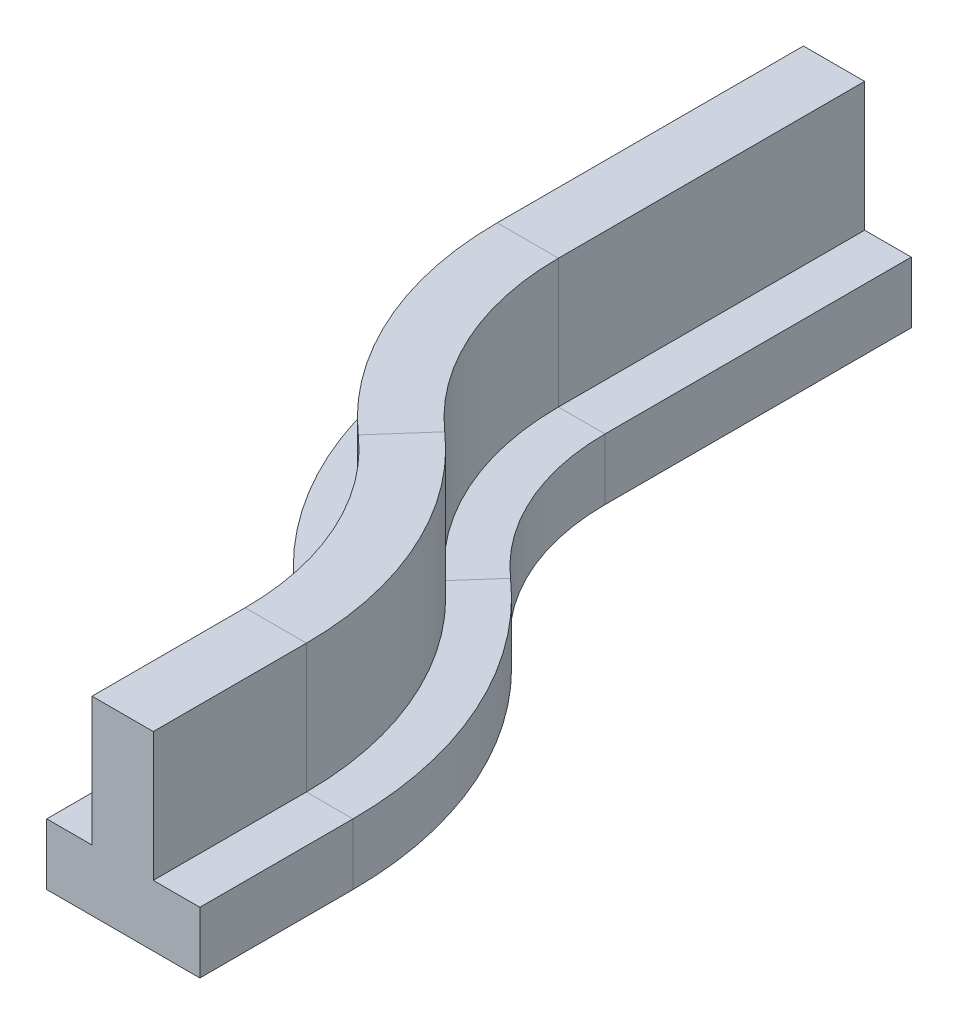
ISO-10303-21;
HEADER;
FILE_DESCRIPTION(('STEP AP214'),'2;1');
FILE_NAME('part.step','',(''),(''),'','','');
FILE_SCHEMA(('AUTOMOTIVE_DESIGN { 1 0 10303 214 1 1 1 1 }'));
ENDSEC;
DATA;
#1=APPLICATION_CONTEXT('core data for automotive mechanical design processes');
#2=APPLICATION_PROTOCOL_DEFINITION('international standard','automotive_design',2000,#1);
#3=PRODUCT_CONTEXT('',#1,'mechanical');
#4=PRODUCT('Part','Part','',(#3));
#5=PRODUCT_RELATED_PRODUCT_CATEGORY('part','',(#4));
#6=PRODUCT_DEFINITION_FORMATION('','',#4);
#7=PRODUCT_DEFINITION_CONTEXT('part definition',#1,'design');
#8=PRODUCT_DEFINITION('design','',#6,#7);
#9=PRODUCT_DEFINITION_SHAPE('','',#8);
#10=(LENGTH_UNIT() NAMED_UNIT(*) SI_UNIT(.MILLI.,.METRE.));
#11=(NAMED_UNIT(*) PLANE_ANGLE_UNIT() SI_UNIT($,.RADIAN.));
#12=(NAMED_UNIT(*) SI_UNIT($,.STERADIAN.) SOLID_ANGLE_UNIT());
#13=UNCERTAINTY_MEASURE_WITH_UNIT(LENGTH_MEASURE(1.E-05),#10,'distance_accuracy_value','');
#14=(GEOMETRIC_REPRESENTATION_CONTEXT(3) GLOBAL_UNCERTAINTY_ASSIGNED_CONTEXT((#13)) GLOBAL_UNIT_ASSIGNED_CONTEXT((#10,
#11,#12)) REPRESENTATION_CONTEXT('',''));
#15=CARTESIAN_POINT('',(0.,0.,0.));
#16=DIRECTION('',(0.,0.,1.));
#17=DIRECTION('',(1.,0.,0.));
#18=AXIS2_PLACEMENT_3D('',#15,#16,#17);
#19=CARTESIAN_POINT('',(0.,0.,0.));
#20=DIRECTION('',(0.,0.,-1.));
#21=DIRECTION('',(-1.,0.,0.));
#22=AXIS2_PLACEMENT_3D('',#19,#20,#21);
#23=PLANE('',#22);
#24=DIRECTION('',(0.,-1.,0.));
#25=VECTOR('',#24,1.);
#26=CARTESIAN_POINT('',(0.,0.,0.));
#27=LINE('',#26,#25);
#28=CARTESIAN_POINT('',(0.,10.,0.));
#29=VERTEX_POINT('',#28);
#30=CARTESIAN_POINT('',(0.,0.,0.));
#31=VERTEX_POINT('',#30);
#32=EDGE_CURVE('E368',#29,#31,#27,.T.);
#33=ORIENTED_EDGE('',*,*,#32,.T.);
#34=DIRECTION('',(1.,0.,0.));
#35=VECTOR('',#34,1.);
#36=CARTESIAN_POINT('',(0.,0.,0.));
#37=LINE('',#36,#35);
#38=CARTESIAN_POINT('',(25.,0.,0.));
#39=VERTEX_POINT('',#38);
#40=EDGE_CURVE('E397',#31,#39,#37,.T.);
#41=ORIENTED_EDGE('',*,*,#40,.T.);
#42=DIRECTION('',(0.,1.,0.));
#43=VECTOR('',#42,1.);
#44=CARTESIAN_POINT('',(25.,0.,0.));
#45=LINE('',#44,#43);
#46=CARTESIAN_POINT('',(25.,10.,0.));
#47=VERTEX_POINT('',#46);
#48=EDGE_CURVE('E255',#39,#47,#45,.T.);
#49=ORIENTED_EDGE('',*,*,#48,.T.);
#50=DIRECTION('',(-1.,0.,0.));
#51=VECTOR('',#50,1.);
#52=CARTESIAN_POINT('',(17.3943661971831,10.,0.));
#53=LINE('',#52,#51);
#54=CARTESIAN_POINT('',(17.3943661971831,10.,0.));
#55=VERTEX_POINT('',#54);
#56=EDGE_CURVE('E252',#47,#55,#53,.T.);
#57=ORIENTED_EDGE('',*,*,#56,.T.);
#58=DIRECTION('',(0.,1.,0.));
#59=VECTOR('',#58,1.);
#60=CARTESIAN_POINT('',(17.3943661971831,31.0446009389672,0.));
#61=LINE('',#60,#59);
#62=CARTESIAN_POINT('',(17.3943661971831,31.0446009389672,0.));
#63=VERTEX_POINT('',#62);
#64=EDGE_CURVE('E201',#55,#63,#61,.T.);
#65=ORIENTED_EDGE('',*,*,#64,.T.);
#66=DIRECTION('',(-1.,0.,0.));
#67=VECTOR('',#66,1.);
#68=CARTESIAN_POINT('',(7.3943661971831,31.0446009389672,0.));
#69=LINE('',#68,#67);
#70=CARTESIAN_POINT('',(7.3943661971831,31.0446009389672,0.));
#71=VERTEX_POINT('',#70);
#72=EDGE_CURVE('E193',#63,#71,#69,.T.);
#73=ORIENTED_EDGE('',*,*,#72,.T.);
#74=DIRECTION('',(0.,-1.,0.));
#75=VECTOR('',#74,1.);
#76=CARTESIAN_POINT('',(7.3943661971831,31.0446009389672,0.));
#77=LINE('',#76,#75);
#78=CARTESIAN_POINT('',(7.3943661971831,10.,0.));
#79=VERTEX_POINT('',#78);
#80=EDGE_CURVE('E186',#71,#79,#77,.T.);
#81=ORIENTED_EDGE('',*,*,#80,.T.);
#82=DIRECTION('',(-1.,0.,0.));
#83=VECTOR('',#82,1.);
#84=CARTESIAN_POINT('',(0.,10.,0.));
#85=LINE('',#84,#83);
#86=EDGE_CURVE('E342',#79,#29,#85,.T.);
#87=ORIENTED_EDGE('',*,*,#86,.T.);
#88=EDGE_LOOP('',(#33,#41,#49,#57,#65,#73,#81,#87));
#89=FACE_BOUND('',#88,.T.);
#90=ADVANCED_FACE('F39',(#89),#23,.F.);
#91=CARTESIAN_POINT('',(-33.8562172233852,0.,-150.));
#92=DIRECTION('',(0.,0.,-1.));
#93=DIRECTION('',(-1.,0.,0.));
#94=AXIS2_PLACEMENT_3D('',#91,#92,#93);
#95=PLANE('',#94);
#96=DIRECTION('',(0.,-1.,0.));
#97=VECTOR('',#96,1.);
#98=CARTESIAN_POINT('',(-33.8562172233852,0.,-150.));
#99=LINE('',#98,#97);
#100=CARTESIAN_POINT('',(-33.8562172233852,10.,-150.));
#101=VERTEX_POINT('',#100);
#102=CARTESIAN_POINT('',(-33.8562172233852,0.,-150.));
#103=VERTEX_POINT('',#102);
#104=EDGE_CURVE('E54',#101,#103,#99,.T.);
#105=ORIENTED_EDGE('',*,*,#104,.F.);
#106=DIRECTION('',(-1.,0.,0.));
#107=VECTOR('',#106,1.);
#108=CARTESIAN_POINT('',(-33.8562172233852,10.,-150.));
#109=LINE('',#108,#107);
#110=CARTESIAN_POINT('',(-26.4618510262021,10.,-150.));
#111=VERTEX_POINT('',#110);
#112=EDGE_CURVE('E63',#111,#101,#109,.T.);
#113=ORIENTED_EDGE('',*,*,#112,.F.);
#114=DIRECTION('',(0.,-1.,0.));
#115=VECTOR('',#114,1.);
#116=CARTESIAN_POINT('',(-26.4618510262021,31.0446009389672,-150.));
#117=LINE('',#116,#115);
#118=CARTESIAN_POINT('',(-26.4618510262021,31.0446009389672,-150.));
#119=VERTEX_POINT('',#118);
#120=EDGE_CURVE('E339',#119,#111,#117,.T.);
#121=ORIENTED_EDGE('',*,*,#120,.F.);
#122=DIRECTION('',(-1.,0.,0.));
#123=VECTOR('',#122,1.);
#124=CARTESIAN_POINT('',(-26.4618510262021,31.0446009389672,-150.));
#125=LINE('',#124,#123);
#126=CARTESIAN_POINT('',(-16.4618510262021,31.0446009389672,-150.));
#127=VERTEX_POINT('',#126);
#128=EDGE_CURVE('E313',#127,#119,#125,.T.);
#129=ORIENTED_EDGE('',*,*,#128,.F.);
#130=DIRECTION('',(0.,1.,0.));
#131=VECTOR('',#130,1.);
#132=CARTESIAN_POINT('',(-16.4618510262021,31.0446009389672,-150.));
#133=LINE('',#132,#131);
#134=CARTESIAN_POINT('',(-16.4618510262021,10.,-150.));
#135=VERTEX_POINT('',#134);
#136=EDGE_CURVE('E236',#135,#127,#133,.T.);
#137=ORIENTED_EDGE('',*,*,#136,.F.);
#138=DIRECTION('',(-1.,0.,0.));
#139=VECTOR('',#138,1.);
#140=CARTESIAN_POINT('',(-16.4618510262021,10.,-150.));
#141=LINE('',#140,#139);
#142=CARTESIAN_POINT('',(-8.85621722338521,10.,-150.));
#143=VERTEX_POINT('',#142);
#144=EDGE_CURVE('E217',#143,#135,#141,.T.);
#145=ORIENTED_EDGE('',*,*,#144,.F.);
#146=DIRECTION('',(0.,1.,0.));
#147=VECTOR('',#146,1.);
#148=CARTESIAN_POINT('',(-8.85621722338521,0.,-150.));
#149=LINE('',#148,#147);
#150=CARTESIAN_POINT('',(-8.85621722338521,0.,-150.));
#151=VERTEX_POINT('',#150);
#152=EDGE_CURVE('E224',#151,#143,#149,.T.);
#153=ORIENTED_EDGE('',*,*,#152,.F.);
#154=DIRECTION('',(1.,0.,0.));
#155=VECTOR('',#154,1.);
#156=CARTESIAN_POINT('',(-33.8562172233852,0.,-150.));
#157=LINE('',#156,#155);
#158=EDGE_CURVE('E11',#103,#151,#157,.T.);
#159=ORIENTED_EDGE('',*,*,#158,.F.);
#160=EDGE_LOOP('',(#105,#113,#121,#129,#137,#145,#153,#159));
#161=FACE_BOUND('',#160,.T.);
#162=ADVANCED_FACE('F234',(#161),#95,.T.);
#163=CARTESIAN_POINT('',(25.,0.,0.));
#164=DIRECTION('',(-1.,0.,0.));
#165=DIRECTION('',(0.,0.,1.));
#166=AXIS2_PLACEMENT_3D('',#163,#164,#165);
#167=PLANE('',#166);
#168=DIRECTION('',(0.,0.,-1.));
#169=VECTOR('',#168,1.);
#170=CARTESIAN_POINT('',(25.,10.,0.));
#171=LINE('',#170,#169);
#172=CARTESIAN_POINT('',(25.,10.,-25.));
#173=VERTEX_POINT('',#172);
#174=EDGE_CURVE('E261',#47,#173,#171,.T.);
#175=ORIENTED_EDGE('',*,*,#174,.F.);
#176=ORIENTED_EDGE('',*,*,#48,.F.);
#177=DIRECTION('',(0.,0.,-1.));
#178=VECTOR('',#177,1.);
#179=CARTESIAN_POINT('',(25.,0.,0.));
#180=LINE('',#179,#178);
#181=CARTESIAN_POINT('',(25.,0.,-25.));
#182=VERTEX_POINT('',#181);
#183=EDGE_CURVE('E428',#39,#182,#180,.T.);
#184=ORIENTED_EDGE('',*,*,#183,.T.);
#185=DIRECTION('',(0.,1.,0.));
#186=VECTOR('',#185,1.);
#187=CARTESIAN_POINT('',(25.,0.,-25.));
#188=LINE('',#187,#186);
#189=EDGE_CURVE('E470',#182,#173,#188,.T.);
#190=ORIENTED_EDGE('',*,*,#189,.T.);
#191=EDGE_LOOP('',(#175,#176,#184,#190));
#192=FACE_BOUND('',#191,.T.);
#193=ADVANCED_FACE('F485',(#192),#167,.F.);
#194=CARTESIAN_POINT('',(17.3943661971831,10.,0.));
#195=DIRECTION('',(0.,-1.,0.));
#196=DIRECTION('',(1.,0.,0.));
#197=AXIS2_PLACEMENT_3D('',#194,#195,#196);
#198=PLANE('',#197);
#199=DIRECTION('',(0.,0.,-1.));
#200=VECTOR('',#199,1.);
#201=CARTESIAN_POINT('',(17.3943661971831,10.,0.));
#202=LINE('',#201,#200);
#203=CARTESIAN_POINT('',(17.3943661971831,10.,-25.));
#204=VERTEX_POINT('',#203);
#205=EDGE_CURVE('E260',#55,#204,#202,.T.);
#206=ORIENTED_EDGE('',*,*,#205,.F.);
#207=ORIENTED_EDGE('',*,*,#56,.F.);
#208=ORIENTED_EDGE('',*,*,#174,.T.);
#209=DIRECTION('',(-1.,0.,0.));
#210=VECTOR('',#209,1.);
#211=CARTESIAN_POINT('',(17.3943661971831,10.,-25.));
#212=LINE('',#211,#210);
#213=EDGE_CURVE('E256',#173,#204,#212,.T.);
#214=ORIENTED_EDGE('',*,*,#213,.T.);
#215=EDGE_LOOP('',(#206,#207,#208,#214));
#216=FACE_BOUND('',#215,.T.);
#217=ADVANCED_FACE('F488',(#216),#198,.F.);
#218=CARTESIAN_POINT('',(17.3943661971831,31.0446009389672,0.));
#219=DIRECTION('',(-1.,0.,0.));
#220=DIRECTION('',(0.,-1.,0.));
#221=AXIS2_PLACEMENT_3D('',#218,#219,#220);
#222=PLANE('',#221);
#223=DIRECTION('',(0.,0.,-1.));
#224=VECTOR('',#223,1.);
#225=CARTESIAN_POINT('',(17.3943661971831,31.0446009389672,0.));
#226=LINE('',#225,#224);
#227=CARTESIAN_POINT('',(17.3943661971831,31.0446009389672,-25.));
#228=VERTEX_POINT('',#227);
#229=EDGE_CURVE('E290',#63,#228,#226,.T.);
#230=ORIENTED_EDGE('',*,*,#229,.F.);
#231=ORIENTED_EDGE('',*,*,#64,.F.);
#232=ORIENTED_EDGE('',*,*,#205,.T.);
#233=DIRECTION('',(0.,1.,0.));
#234=VECTOR('',#233,1.);
#235=CARTESIAN_POINT('',(17.3943661971831,31.0446009389672,-25.));
#236=LINE('',#235,#234);
#237=EDGE_CURVE('E264',#204,#228,#236,.T.);
#238=ORIENTED_EDGE('',*,*,#237,.T.);
#239=EDGE_LOOP('',(#230,#231,#232,#238));
#240=FACE_BOUND('',#239,.T.);
#241=ADVANCED_FACE('F566',(#240),#222,.F.);
#242=CARTESIAN_POINT('',(7.3943661971831,31.0446009389672,0.));
#243=DIRECTION('',(0.,-1.,0.));
#244=DIRECTION('',(0.,0.,-1.));
#245=AXIS2_PLACEMENT_3D('',#242,#243,#244);
#246=PLANE('',#245);
#247=DIRECTION('',(0.,0.,-1.));
#248=VECTOR('',#247,1.);
#249=CARTESIAN_POINT('',(7.3943661971831,31.0446009389672,0.));
#250=LINE('',#249,#248);
#251=CARTESIAN_POINT('',(7.3943661971831,31.0446009389672,-25.));
#252=VERTEX_POINT('',#251);
#253=EDGE_CURVE('E319',#71,#252,#250,.T.);
#254=ORIENTED_EDGE('',*,*,#253,.F.);
#255=ORIENTED_EDGE('',*,*,#72,.F.);
#256=ORIENTED_EDGE('',*,*,#229,.T.);
#257=DIRECTION('',(-1.,0.,0.));
#258=VECTOR('',#257,1.);
#259=CARTESIAN_POINT('',(7.3943661971831,31.0446009389672,-25.));
#260=LINE('',#259,#258);
#261=EDGE_CURVE('E293',#228,#252,#260,.T.);
#262=ORIENTED_EDGE('',*,*,#261,.T.);
#263=EDGE_LOOP('',(#254,#255,#256,#262));
#264=FACE_BOUND('',#263,.T.);
#265=ADVANCED_FACE('F575',(#264),#246,.F.);
#266=CARTESIAN_POINT('',(7.3943661971831,31.0446009389672,0.));
#267=DIRECTION('',(1.,0.,0.));
#268=DIRECTION('',(0.,0.,-1.));
#269=AXIS2_PLACEMENT_3D('',#266,#267,#268);
#270=PLANE('',#269);
#271=DIRECTION('',(0.,0.,-1.));
#272=VECTOR('',#271,1.);
#273=CARTESIAN_POINT('',(7.3943661971831,10.,0.));
#274=LINE('',#273,#272);
#275=CARTESIAN_POINT('',(7.3943661971831,10.,-25.));
#276=VERTEX_POINT('',#275);
#277=EDGE_CURVE('E346',#79,#276,#274,.T.);
#278=ORIENTED_EDGE('',*,*,#277,.F.);
#279=ORIENTED_EDGE('',*,*,#80,.F.);
#280=ORIENTED_EDGE('',*,*,#253,.T.);
#281=DIRECTION('',(0.,-1.,0.));
#282=VECTOR('',#281,1.);
#283=CARTESIAN_POINT('',(7.3943661971831,31.0446009389672,-25.));
#284=LINE('',#283,#282);
#285=EDGE_CURVE('E322',#252,#276,#284,.T.);
#286=ORIENTED_EDGE('',*,*,#285,.T.);
#287=EDGE_LOOP('',(#278,#279,#280,#286));
#288=FACE_BOUND('',#287,.T.);
#289=ADVANCED_FACE('F584',(#288),#270,.F.);
#290=CARTESIAN_POINT('',(0.,10.,0.));
#291=DIRECTION('',(0.,-1.,0.));
#292=DIRECTION('',(1.,0.,0.));
#293=AXIS2_PLACEMENT_3D('',#290,#291,#292);
#294=PLANE('',#293);
#295=DIRECTION('',(0.,0.,-1.));
#296=VECTOR('',#295,1.);
#297=CARTESIAN_POINT('',(0.,10.,0.));
#298=LINE('',#297,#296);
#299=CARTESIAN_POINT('',(0.,10.,-25.));
#300=VERTEX_POINT('',#299);
#301=EDGE_CURVE('E372',#29,#300,#298,.T.);
#302=ORIENTED_EDGE('',*,*,#301,.F.);
#303=ORIENTED_EDGE('',*,*,#86,.F.);
#304=ORIENTED_EDGE('',*,*,#277,.T.);
#305=DIRECTION('',(-1.,0.,0.));
#306=VECTOR('',#305,1.);
#307=CARTESIAN_POINT('',(0.,10.,-25.));
#308=LINE('',#307,#306);
#309=EDGE_CURVE('E350',#276,#300,#308,.T.);
#310=ORIENTED_EDGE('',*,*,#309,.T.);
#311=EDGE_LOOP('',(#302,#303,#304,#310));
#312=FACE_BOUND('',#311,.T.);
#313=ADVANCED_FACE('F593',(#312),#294,.F.);
#314=CARTESIAN_POINT('',(0.,0.,0.));
#315=DIRECTION('',(1.,0.,0.));
#316=DIRECTION('',(0.,0.,-1.));
#317=AXIS2_PLACEMENT_3D('',#314,#315,#316);
#318=PLANE('',#317);
#319=DIRECTION('',(0.,0.,-1.));
#320=VECTOR('',#319,1.);
#321=CARTESIAN_POINT('',(0.,0.,0.));
#322=LINE('',#321,#320);
#323=CARTESIAN_POINT('',(0.,0.,-25.));
#324=VERTEX_POINT('',#323);
#325=EDGE_CURVE('E401',#31,#324,#322,.T.);
#326=ORIENTED_EDGE('',*,*,#325,.F.);
#327=ORIENTED_EDGE('',*,*,#32,.F.);
#328=ORIENTED_EDGE('',*,*,#301,.T.);
#329=DIRECTION('',(0.,-1.,0.));
#330=VECTOR('',#329,1.);
#331=CARTESIAN_POINT('',(0.,0.,-25.));
#332=LINE('',#331,#330);
#333=EDGE_CURVE('E376',#300,#324,#332,.T.);
#334=ORIENTED_EDGE('',*,*,#333,.T.);
#335=EDGE_LOOP('',(#326,#327,#328,#334));
#336=FACE_BOUND('',#335,.T.);
#337=ADVANCED_FACE('F513',(#336),#318,.F.);
#338=CARTESIAN_POINT('',(0.,0.,0.));
#339=DIRECTION('',(0.,1.,0.));
#340=DIRECTION('',(0.,0.,1.));
#341=AXIS2_PLACEMENT_3D('',#338,#339,#340);
#342=PLANE('',#341);
#343=DIRECTION('',(1.,0.,0.));
#344=VECTOR('',#343,1.);
#345=CARTESIAN_POINT('',(0.,0.,-25.));
#346=LINE('',#345,#344);
#347=EDGE_CURVE('E405',#324,#182,#346,.T.);
#348=ORIENTED_EDGE('',*,*,#347,.T.);
#349=ORIENTED_EDGE('',*,*,#183,.F.);
#350=ORIENTED_EDGE('',*,*,#40,.F.);
#351=ORIENTED_EDGE('',*,*,#325,.T.);
#352=EDGE_LOOP('',(#348,#349,#350,#351));
#353=FACE_BOUND('',#352,.T.);
#354=ADVANCED_FACE('F509',(#353),#342,.F.);
#355=CARTESIAN_POINT('',(-37.5,0.,-25.));
#356=DIRECTION('',(0.,1.,0.));
#357=DIRECTION('',(0.,0.,1.));
#358=AXIS2_PLACEMENT_3D('',#355,#356,#357);
#359=CYLINDRICAL_SURFACE('',#358,62.5);
#360=CARTESIAN_POINT('',(-37.5,10.,-25.));
#361=DIRECTION('',(0.,1.,0.));
#362=DIRECTION('',(1.,0.,0.));
#363=AXIS2_PLACEMENT_3D('',#360,#361,#362);
#364=CIRCLE('',#363,62.5);
#365=CARTESIAN_POINT('',(3.83986423538425,10.,-71.875));
#366=VERTEX_POINT('',#365);
#367=EDGE_CURVE('E270',#173,#366,#364,.T.);
#368=ORIENTED_EDGE('',*,*,#367,.F.);
#369=ORIENTED_EDGE('',*,*,#189,.F.);
#370=CARTESIAN_POINT('',(-37.5,0.,-25.));
#371=DIRECTION('',(0.,1.,0.));
#372=DIRECTION('',(1.,0.,0.));
#373=AXIS2_PLACEMENT_3D('',#370,#371,#372);
#374=CIRCLE('',#373,62.5);
#375=CARTESIAN_POINT('',(3.83986423538425,0.,-71.875));
#376=VERTEX_POINT('',#375);
#377=EDGE_CURVE('E432',#182,#376,#374,.T.);
#378=ORIENTED_EDGE('',*,*,#377,.T.);
#379=DIRECTION('',(0.,1.,0.));
#380=VECTOR('',#379,1.);
#381=CARTESIAN_POINT('',(3.83986423538424,0.,-71.875));
#382=LINE('',#381,#380);
#383=EDGE_CURVE('E454',#376,#366,#382,.T.);
#384=ORIENTED_EDGE('',*,*,#383,.T.);
#385=EDGE_LOOP('',(#368,#369,#378,#384));
#386=FACE_BOUND('',#385,.T.);
#387=ADVANCED_FACE('F504',(#386),#359,.T.);
#388=CARTESIAN_POINT('',(17.3943661971831,10.,-25.));
#389=DIRECTION('',(0.,-1.,0.));
#390=DIRECTION('',(0.,0.,-1.));
#391=AXIS2_PLACEMENT_3D('',#388,#389,#390);
#392=PLANE('',#391);
#393=CARTESIAN_POINT('',(-37.5,10.,-25.));
#394=DIRECTION('',(0.,1.,0.));
#395=DIRECTION('',(1.,0.,0.));
#396=AXIS2_PLACEMENT_3D('',#393,#394,#395);
#397=CIRCLE('',#396,54.8943661971831);
#398=CARTESIAN_POINT('',(-1.19078966593576,10.,-66.1707746478873));
#399=VERTEX_POINT('',#398);
#400=EDGE_CURVE('E269',#204,#399,#397,.T.);
#401=ORIENTED_EDGE('',*,*,#400,.F.);
#402=ORIENTED_EDGE('',*,*,#213,.F.);
#403=ORIENTED_EDGE('',*,*,#367,.T.);
#404=DIRECTION('',(-0.661437827766148,0.,0.75));
#405=VECTOR('',#404,1.);
#406=CARTESIAN_POINT('',(-1.19078966593575,10.,-66.1707746478873));
#407=LINE('',#406,#405);
#408=EDGE_CURVE('E265',#366,#399,#407,.T.);
#409=ORIENTED_EDGE('',*,*,#408,.T.);
#410=EDGE_LOOP('',(#401,#402,#403,#409));
#411=FACE_BOUND('',#410,.T.);
#412=ADVANCED_FACE('F503',(#411),#392,.F.);
#413=CARTESIAN_POINT('',(-37.5,0.,-25.));
#414=DIRECTION('',(0.,1.,0.));
#415=DIRECTION('',(0.,0.,1.));
#416=AXIS2_PLACEMENT_3D('',#413,#414,#415);
#417=CYLINDRICAL_SURFACE('',#416,54.8943661971831);
#418=CARTESIAN_POINT('',(-37.5,31.0446009389672,-25.));
#419=DIRECTION('',(0.,1.,0.));
#420=DIRECTION('',(1.,0.,0.));
#421=AXIS2_PLACEMENT_3D('',#418,#419,#420);
#422=CIRCLE('',#421,54.8943661971831);
#423=CARTESIAN_POINT('',(-1.19078966593576,31.0446009389672,-66.1707746478873));
#424=VERTEX_POINT('',#423);
#425=EDGE_CURVE('E168',#228,#424,#422,.T.);
#426=ORIENTED_EDGE('',*,*,#425,.F.);
#427=ORIENTED_EDGE('',*,*,#237,.F.);
#428=ORIENTED_EDGE('',*,*,#400,.T.);
#429=DIRECTION('',(0.,1.,0.));
#430=VECTOR('',#429,1.);
#431=CARTESIAN_POINT('',(-1.19078966593576,31.0446009389672,-66.1707746478873));
#432=LINE('',#431,#430);
#433=EDGE_CURVE('E274',#399,#424,#432,.T.);
#434=ORIENTED_EDGE('',*,*,#433,.T.);
#435=EDGE_LOOP('',(#426,#427,#428,#434));
#436=FACE_BOUND('',#435,.T.);
#437=ADVANCED_FACE('F633',(#436),#417,.T.);
#438=CARTESIAN_POINT('',(7.39436619718309,31.0446009389672,-25.));
#439=DIRECTION('',(0.,-1.,0.));
#440=DIRECTION('',(0.,0.,-1.));
#441=AXIS2_PLACEMENT_3D('',#438,#439,#440);
#442=PLANE('',#441);
#443=CARTESIAN_POINT('',(-37.5,31.0446009389672,-25.));
#444=DIRECTION('',(0.,1.,0.));
#445=DIRECTION('',(1.,0.,0.));
#446=AXIS2_PLACEMENT_3D('',#443,#444,#445);
#447=CIRCLE('',#446,44.8943661971831);
#448=CARTESIAN_POINT('',(-7.80516794359723,31.0446009389672,-58.6707746478873));
#449=VERTEX_POINT('',#448);
#450=EDGE_CURVE('E160',#252,#449,#447,.T.);
#451=ORIENTED_EDGE('',*,*,#450,.F.);
#452=ORIENTED_EDGE('',*,*,#261,.F.);
#453=ORIENTED_EDGE('',*,*,#425,.T.);
#454=DIRECTION('',(-0.661437827766148,0.,0.75));
#455=VECTOR('',#454,1.);
#456=CARTESIAN_POINT('',(-7.80516794359724,31.0446009389672,-58.6707746478873));
#457=LINE('',#456,#455);
#458=EDGE_CURVE('E298',#424,#449,#457,.T.);
#459=ORIENTED_EDGE('',*,*,#458,.T.);
#460=EDGE_LOOP('',(#451,#452,#453,#459));
#461=FACE_BOUND('',#460,.T.);
#462=ADVANCED_FACE('F642',(#461),#442,.F.);
#463=CARTESIAN_POINT('',(-37.5,0.,-25.));
#464=DIRECTION('',(0.,1.,0.));
#465=DIRECTION('',(0.,0.,1.));
#466=AXIS2_PLACEMENT_3D('',#463,#464,#465);
#467=CYLINDRICAL_SURFACE('',#466,44.8943661971831);
#468=CARTESIAN_POINT('',(-37.5,10.,-25.));
#469=DIRECTION('',(0.,1.,0.));
#470=DIRECTION('',(1.,0.,0.));
#471=AXIS2_PLACEMENT_3D('',#468,#469,#470);
#472=CIRCLE('',#471,44.8943661971831);
#473=CARTESIAN_POINT('',(-7.80516794359723,10.,-58.6707746478873));
#474=VERTEX_POINT('',#473);
#475=EDGE_CURVE('E152',#276,#474,#472,.T.);
#476=ORIENTED_EDGE('',*,*,#475,.F.);
#477=ORIENTED_EDGE('',*,*,#285,.F.);
#478=ORIENTED_EDGE('',*,*,#450,.T.);
#479=DIRECTION('',(0.,-1.,0.));
#480=VECTOR('',#479,1.);
#481=CARTESIAN_POINT('',(-7.80516794359724,31.0446009389672,-58.6707746478873));
#482=LINE('',#481,#480);
#483=EDGE_CURVE('E327',#449,#474,#482,.T.);
#484=ORIENTED_EDGE('',*,*,#483,.T.);
#485=EDGE_LOOP('',(#476,#477,#478,#484));
#486=FACE_BOUND('',#485,.T.);
#487=ADVANCED_FACE('F651',(#486),#467,.F.);
#488=CARTESIAN_POINT('',(0.,10.,-25.));
#489=DIRECTION('',(0.,-1.,0.));
#490=DIRECTION('',(0.,0.,-1.));
#491=AXIS2_PLACEMENT_3D('',#488,#489,#490);
#492=PLANE('',#491);
#493=CARTESIAN_POINT('',(-37.5,10.,-25.));
#494=DIRECTION('',(0.,1.,0.));
#495=DIRECTION('',(1.,0.,0.));
#496=AXIS2_PLACEMENT_3D('',#493,#494,#495);
#497=CIRCLE('',#496,37.5);
#498=CARTESIAN_POINT('',(-12.6960814587695,10.,-53.125));
#499=VERTEX_POINT('',#498);
#500=EDGE_CURVE('E380',#300,#499,#497,.T.);
#501=ORIENTED_EDGE('',*,*,#500,.F.);
#502=ORIENTED_EDGE('',*,*,#309,.F.);
#503=ORIENTED_EDGE('',*,*,#475,.T.);
#504=DIRECTION('',(-0.661437827766148,0.,0.75));
#505=VECTOR('',#504,1.);
#506=CARTESIAN_POINT('',(-12.6960814587695,10.,-53.125));
#507=LINE('',#506,#505);
#508=EDGE_CURVE('E355',#474,#499,#507,.T.);
#509=ORIENTED_EDGE('',*,*,#508,.T.);
#510=EDGE_LOOP('',(#501,#502,#503,#509));
#511=FACE_BOUND('',#510,.T.);
#512=ADVANCED_FACE('F660',(#511),#492,.F.);
#513=CARTESIAN_POINT('',(-37.5,0.,-25.));
#514=DIRECTION('',(0.,1.,0.));
#515=DIRECTION('',(0.,0.,1.));
#516=AXIS2_PLACEMENT_3D('',#513,#514,#515);
#517=CYLINDRICAL_SURFACE('',#516,37.5);
#518=CARTESIAN_POINT('',(-37.5,0.,-25.));
#519=DIRECTION('',(0.,1.,0.));
#520=DIRECTION('',(1.,0.,0.));
#521=AXIS2_PLACEMENT_3D('',#518,#519,#520);
#522=CIRCLE('',#521,37.5);
#523=CARTESIAN_POINT('',(-12.6960814587695,0.,-53.125));
#524=VERTEX_POINT('',#523);
#525=EDGE_CURVE('E409',#324,#524,#522,.T.);
#526=ORIENTED_EDGE('',*,*,#525,.F.);
#527=ORIENTED_EDGE('',*,*,#333,.F.);
#528=ORIENTED_EDGE('',*,*,#500,.T.);
#529=DIRECTION('',(0.,-1.,0.));
#530=VECTOR('',#529,1.);
#531=CARTESIAN_POINT('',(-12.6960814587695,0.,-53.125));
#532=LINE('',#531,#530);
#533=EDGE_CURVE('E384',#499,#524,#532,.T.);
#534=ORIENTED_EDGE('',*,*,#533,.T.);
#535=EDGE_LOOP('',(#526,#527,#528,#534));
#536=FACE_BOUND('',#535,.T.);
#537=ADVANCED_FACE('F516',(#536),#517,.F.);
#538=CARTESIAN_POINT('',(0.,0.,-25.));
#539=DIRECTION('',(0.,1.,0.));
#540=DIRECTION('',(0.,0.,1.));
#541=AXIS2_PLACEMENT_3D('',#538,#539,#540);
#542=PLANE('',#541);
#543=DIRECTION('',(0.661437827766148,0.,-0.75));
#544=VECTOR('',#543,1.);
#545=CARTESIAN_POINT('',(-12.6960814587695,0.,-53.125));
#546=LINE('',#545,#544);
#547=EDGE_CURVE('E413',#524,#376,#546,.T.);
#548=ORIENTED_EDGE('',*,*,#547,.T.);
#549=ORIENTED_EDGE('',*,*,#377,.F.);
#550=ORIENTED_EDGE('',*,*,#347,.F.);
#551=ORIENTED_EDGE('',*,*,#525,.T.);
#552=EDGE_LOOP('',(#548,#549,#550,#551));
#553=FACE_BOUND('',#552,.T.);
#554=ADVANCED_FACE('F507',(#553),#542,.F.);
#555=CARTESIAN_POINT('',(28.6437827766148,0.,-100.));
#556=DIRECTION('',(0.,-1.,0.));
#557=DIRECTION('',(0.,0.,-1.));
#558=AXIS2_PLACEMENT_3D('',#555,#556,#557);
#559=CYLINDRICAL_SURFACE('',#558,37.5);
#560=CARTESIAN_POINT('',(28.6437827766148,10.,-100.));
#561=DIRECTION('',(0.,-1.,0.));
#562=DIRECTION('',(-0.661437827766148,0.,0.75));
#563=AXIS2_PLACEMENT_3D('',#560,#561,#562);
#564=CIRCLE('',#563,37.5);
#565=CARTESIAN_POINT('',(-8.8562172233852,10.,-100.));
#566=VERTEX_POINT('',#565);
#567=EDGE_CURVE('E278',#366,#566,#564,.T.);
#568=ORIENTED_EDGE('',*,*,#567,.F.);
#569=ORIENTED_EDGE('',*,*,#383,.F.);
#570=CARTESIAN_POINT('',(28.6437827766148,0.,-100.));
#571=DIRECTION('',(0.,-1.,0.));
#572=DIRECTION('',(-0.661437827766148,0.,0.75));
#573=AXIS2_PLACEMENT_3D('',#570,#571,#572);
#574=CIRCLE('',#573,37.5);
#575=CARTESIAN_POINT('',(-8.8562172233852,0.,-100.));
#576=VERTEX_POINT('',#575);
#577=EDGE_CURVE('E435',#376,#576,#574,.T.);
#578=ORIENTED_EDGE('',*,*,#577,.T.);
#579=DIRECTION('',(0.,1.,0.));
#580=VECTOR('',#579,1.);
#581=CARTESIAN_POINT('',(-8.85621722338521,0.,-100.));
#582=LINE('',#581,#580);
#583=EDGE_CURVE('E446',#576,#566,#582,.T.);
#584=ORIENTED_EDGE('',*,*,#583,.T.);
#585=EDGE_LOOP('',(#568,#569,#578,#584));
#586=FACE_BOUND('',#585,.T.);
#587=ADVANCED_FACE('F452',(#586),#559,.F.);
#588=CARTESIAN_POINT('',(-1.19078966593575,10.,-66.1707746478873));
#589=DIRECTION('',(0.,-1.,0.));
#590=DIRECTION('',(0.,0.,-1.));
#591=AXIS2_PLACEMENT_3D('',#588,#589,#590);
#592=PLANE('',#591);
#593=CARTESIAN_POINT('',(28.6437827766148,10.,-100.));
#594=DIRECTION('',(0.,-1.,0.));
#595=DIRECTION('',(-0.661437827766148,0.,0.75));
#596=AXIS2_PLACEMENT_3D('',#593,#594,#595);
#597=CIRCLE('',#596,45.1056338028169);
#598=CARTESIAN_POINT('',(-16.4618510262021,10.,-100.));
#599=VERTEX_POINT('',#598);
#600=EDGE_CURVE('E277',#399,#599,#597,.T.);
#601=ORIENTED_EDGE('',*,*,#600,.F.);
#602=ORIENTED_EDGE('',*,*,#408,.F.);
#603=ORIENTED_EDGE('',*,*,#567,.T.);
#604=DIRECTION('',(-1.,0.,0.));
#605=VECTOR('',#604,1.);
#606=CARTESIAN_POINT('',(-16.4618510262021,10.,-100.));
#607=LINE('',#606,#605);
#608=EDGE_CURVE('E243',#566,#599,#607,.T.);
#609=ORIENTED_EDGE('',*,*,#608,.T.);
#610=EDGE_LOOP('',(#601,#602,#603,#609));
#611=FACE_BOUND('',#610,.T.);
#612=ADVANCED_FACE('F500',(#611),#592,.F.);
#613=CARTESIAN_POINT('',(28.6437827766148,0.,-100.));
#614=DIRECTION('',(0.,-1.,0.));
#615=DIRECTION('',(0.,0.,-1.));
#616=AXIS2_PLACEMENT_3D('',#613,#614,#615);
#617=CYLINDRICAL_SURFACE('',#616,45.1056338028169);
#618=CARTESIAN_POINT('',(28.6437827766148,31.0446009389672,-100.));
#619=DIRECTION('',(0.,-1.,0.));
#620=DIRECTION('',(-0.661437827766148,0.,0.75));
#621=AXIS2_PLACEMENT_3D('',#618,#619,#620);
#622=CIRCLE('',#621,45.1056338028169);
#623=CARTESIAN_POINT('',(-16.4618510262021,31.0446009389672,-100.));
#624=VERTEX_POINT('',#623);
#625=EDGE_CURVE('E302',#424,#624,#622,.T.);
#626=ORIENTED_EDGE('',*,*,#625,.F.);
#627=ORIENTED_EDGE('',*,*,#433,.F.);
#628=ORIENTED_EDGE('',*,*,#600,.T.);
#629=DIRECTION('',(0.,1.,0.));
#630=VECTOR('',#629,1.);
#631=CARTESIAN_POINT('',(-16.4618510262021,31.0446009389672,-100.));
#632=LINE('',#631,#630);
#633=EDGE_CURVE('E281',#599,#624,#632,.T.);
#634=ORIENTED_EDGE('',*,*,#633,.T.);
#635=EDGE_LOOP('',(#626,#627,#628,#634));
#636=FACE_BOUND('',#635,.T.);
#637=ADVANCED_FACE('F699',(#636),#617,.F.);
#638=CARTESIAN_POINT('',(-7.80516794359723,31.0446009389672,-58.6707746478873));
#639=DIRECTION('',(0.,-1.,0.));
#640=DIRECTION('',(0.,0.,-1.));
#641=AXIS2_PLACEMENT_3D('',#638,#639,#640);
#642=PLANE('',#641);
#643=CARTESIAN_POINT('',(28.6437827766148,31.0446009389672,-100.));
#644=DIRECTION('',(0.,-1.,0.));
#645=DIRECTION('',(-0.661437827766148,0.,0.75));
#646=AXIS2_PLACEMENT_3D('',#643,#644,#645);
#647=CIRCLE('',#646,55.1056338028169);
#648=CARTESIAN_POINT('',(-26.4618510262021,31.0446009389672,-100.));
#649=VERTEX_POINT('',#648);
#650=EDGE_CURVE('E134',#449,#649,#647,.T.);
#651=ORIENTED_EDGE('',*,*,#650,.F.);
#652=ORIENTED_EDGE('',*,*,#458,.F.);
#653=ORIENTED_EDGE('',*,*,#625,.T.);
#654=DIRECTION('',(-1.,0.,0.));
#655=VECTOR('',#654,1.);
#656=CARTESIAN_POINT('',(-26.4618510262021,31.0446009389672,-100.));
#657=LINE('',#656,#655);
#658=EDGE_CURVE('E306',#624,#649,#657,.T.);
#659=ORIENTED_EDGE('',*,*,#658,.T.);
#660=EDGE_LOOP('',(#651,#652,#653,#659));
#661=FACE_BOUND('',#660,.T.);
#662=ADVANCED_FACE('F708',(#661),#642,.F.);
#663=CARTESIAN_POINT('',(28.6437827766148,0.,-100.));
#664=DIRECTION('',(0.,-1.,0.));
#665=DIRECTION('',(0.,0.,-1.));
#666=AXIS2_PLACEMENT_3D('',#663,#664,#665);
#667=CYLINDRICAL_SURFACE('',#666,55.1056338028169);
#668=CARTESIAN_POINT('',(28.6437827766148,10.,-100.));
#669=DIRECTION('',(0.,-1.,0.));
#670=DIRECTION('',(-0.661437827766148,0.,0.75));
#671=AXIS2_PLACEMENT_3D('',#668,#669,#670);
#672=CIRCLE('',#671,55.1056338028169);
#673=CARTESIAN_POINT('',(-26.4618510262021,10.,-100.));
#674=VERTEX_POINT('',#673);
#675=EDGE_CURVE('E126',#474,#674,#672,.T.);
#676=ORIENTED_EDGE('',*,*,#675,.F.);
#677=ORIENTED_EDGE('',*,*,#483,.F.);
#678=ORIENTED_EDGE('',*,*,#650,.T.);
#679=DIRECTION('',(0.,-1.,0.));
#680=VECTOR('',#679,1.);
#681=CARTESIAN_POINT('',(-26.4618510262021,31.0446009389672,-100.));
#682=LINE('',#681,#680);
#683=EDGE_CURVE('E332',#649,#674,#682,.T.);
#684=ORIENTED_EDGE('',*,*,#683,.T.);
#685=EDGE_LOOP('',(#676,#677,#678,#684));
#686=FACE_BOUND('',#685,.T.);
#687=ADVANCED_FACE('F718',(#686),#667,.T.);
#688=CARTESIAN_POINT('',(-12.6960814587694,10.,-53.125));
#689=DIRECTION('',(0.,-1.,0.));
#690=DIRECTION('',(0.,0.,-1.));
#691=AXIS2_PLACEMENT_3D('',#688,#689,#690);
#692=PLANE('',#691);
#693=CARTESIAN_POINT('',(28.6437827766148,10.,-100.));
#694=DIRECTION('',(0.,-1.,0.));
#695=DIRECTION('',(-0.661437827766148,0.,0.75));
#696=AXIS2_PLACEMENT_3D('',#693,#694,#695);
#697=CIRCLE('',#696,62.5);
#698=CARTESIAN_POINT('',(-33.8562172233852,10.,-100.));
#699=VERTEX_POINT('',#698);
#700=EDGE_CURVE('E118',#499,#699,#697,.T.);
#701=ORIENTED_EDGE('',*,*,#700,.F.);
#702=ORIENTED_EDGE('',*,*,#508,.F.);
#703=ORIENTED_EDGE('',*,*,#675,.T.);
#704=DIRECTION('',(-1.,0.,0.));
#705=VECTOR('',#704,1.);
#706=CARTESIAN_POINT('',(-33.8562172233852,10.,-100.));
#707=LINE('',#706,#705);
#708=EDGE_CURVE('E360',#674,#699,#707,.T.);
#709=ORIENTED_EDGE('',*,*,#708,.T.);
#710=EDGE_LOOP('',(#701,#702,#703,#709));
#711=FACE_BOUND('',#710,.T.);
#712=ADVANCED_FACE('F727',(#711),#692,.F.);
#713=CARTESIAN_POINT('',(28.6437827766148,0.,-100.));
#714=DIRECTION('',(0.,-1.,0.));
#715=DIRECTION('',(0.,0.,-1.));
#716=AXIS2_PLACEMENT_3D('',#713,#714,#715);
#717=CYLINDRICAL_SURFACE('',#716,62.5);
#718=CARTESIAN_POINT('',(28.6437827766148,0.,-100.));
#719=DIRECTION('',(0.,-1.,0.));
#720=DIRECTION('',(-0.661437827766148,0.,0.75));
#721=AXIS2_PLACEMENT_3D('',#718,#719,#720);
#722=CIRCLE('',#721,62.5);
#723=CARTESIAN_POINT('',(-33.8562172233852,0.,-100.));
#724=VERTEX_POINT('',#723);
#725=EDGE_CURVE('E417',#524,#724,#722,.T.);
#726=ORIENTED_EDGE('',*,*,#725,.F.);
#727=ORIENTED_EDGE('',*,*,#533,.F.);
#728=ORIENTED_EDGE('',*,*,#700,.T.);
#729=DIRECTION('',(0.,-1.,0.));
#730=VECTOR('',#729,1.);
#731=CARTESIAN_POINT('',(-33.8562172233852,0.,-100.));
#732=LINE('',#731,#730);
#733=EDGE_CURVE('E389',#699,#724,#732,.T.);
#734=ORIENTED_EDGE('',*,*,#733,.T.);
#735=EDGE_LOOP('',(#726,#727,#728,#734));
#736=FACE_BOUND('',#735,.T.);
#737=ADVANCED_FACE('F518',(#736),#717,.T.);
#738=CARTESIAN_POINT('',(-12.6960814587694,0.,-53.125));
#739=DIRECTION('',(0.,1.,0.));
#740=DIRECTION('',(0.,0.,1.));
#741=AXIS2_PLACEMENT_3D('',#738,#739,#740);
#742=PLANE('',#741);
#743=DIRECTION('',(1.,0.,0.));
#744=VECTOR('',#743,1.);
#745=CARTESIAN_POINT('',(-33.8562172233852,0.,-100.));
#746=LINE('',#745,#744);
#747=EDGE_CURVE('E251',#724,#576,#746,.T.);
#748=ORIENTED_EDGE('',*,*,#747,.T.);
#749=ORIENTED_EDGE('',*,*,#577,.F.);
#750=ORIENTED_EDGE('',*,*,#547,.F.);
#751=ORIENTED_EDGE('',*,*,#725,.T.);
#752=EDGE_LOOP('',(#748,#749,#750,#751));
#753=FACE_BOUND('',#752,.T.);
#754=ADVANCED_FACE('F440',(#753),#742,.F.);
#755=CARTESIAN_POINT('',(-8.85621722338521,0.,-100.));
#756=DIRECTION('',(-1.,0.,0.));
#757=DIRECTION('',(0.,0.,1.));
#758=AXIS2_PLACEMENT_3D('',#755,#756,#757);
#759=PLANE('',#758);
#760=DIRECTION('',(0.,0.,-1.));
#761=VECTOR('',#760,1.);
#762=CARTESIAN_POINT('',(-8.85621722338521,10.,-100.));
#763=LINE('',#762,#761);
#764=EDGE_CURVE('E227',#566,#143,#763,.T.);
#765=ORIENTED_EDGE('',*,*,#764,.F.);
#766=ORIENTED_EDGE('',*,*,#583,.F.);
#767=DIRECTION('',(0.,0.,-1.));
#768=VECTOR('',#767,1.);
#769=CARTESIAN_POINT('',(-8.85621722338521,0.,-100.));
#770=LINE('',#769,#768);
#771=EDGE_CURVE('E230',#576,#151,#770,.T.);
#772=ORIENTED_EDGE('',*,*,#771,.T.);
#773=ORIENTED_EDGE('',*,*,#152,.T.);
#774=EDGE_LOOP('',(#765,#766,#772,#773));
#775=FACE_BOUND('',#774,.T.);
#776=ADVANCED_FACE('F225',(#775),#759,.F.);
#777=CARTESIAN_POINT('',(-16.4618510262021,10.,-100.));
#778=DIRECTION('',(0.,-1.,0.));
#779=DIRECTION('',(1.,0.,0.));
#780=AXIS2_PLACEMENT_3D('',#777,#778,#779);
#781=PLANE('',#780);
#782=DIRECTION('',(0.,0.,-1.));
#783=VECTOR('',#782,1.);
#784=CARTESIAN_POINT('',(-16.4618510262021,10.,-100.));
#785=LINE('',#784,#783);
#786=EDGE_CURVE('E239',#599,#135,#785,.T.);
#787=ORIENTED_EDGE('',*,*,#786,.F.);
#788=ORIENTED_EDGE('',*,*,#608,.F.);
#789=ORIENTED_EDGE('',*,*,#764,.T.);
#790=ORIENTED_EDGE('',*,*,#144,.T.);
#791=EDGE_LOOP('',(#787,#788,#789,#790));
#792=FACE_BOUND('',#791,.T.);
#793=ADVANCED_FACE('F241',(#792),#781,.F.);
#794=CARTESIAN_POINT('',(-16.4618510262021,31.0446009389672,-100.));
#795=DIRECTION('',(-1.,0.,0.));
#796=DIRECTION('',(0.,-1.,0.));
#797=AXIS2_PLACEMENT_3D('',#794,#795,#796);
#798=PLANE('',#797);
#799=DIRECTION('',(0.,0.,-1.));
#800=VECTOR('',#799,1.);
#801=CARTESIAN_POINT('',(-16.4618510262021,31.0446009389672,-100.));
#802=LINE('',#801,#800);
#803=EDGE_CURVE('E309',#624,#127,#802,.T.);
#804=ORIENTED_EDGE('',*,*,#803,.F.);
#805=ORIENTED_EDGE('',*,*,#633,.F.);
#806=ORIENTED_EDGE('',*,*,#786,.T.);
#807=ORIENTED_EDGE('',*,*,#136,.T.);
#808=EDGE_LOOP('',(#804,#805,#806,#807));
#809=FACE_BOUND('',#808,.T.);
#810=ADVANCED_FACE('F765',(#809),#798,.F.);
#811=CARTESIAN_POINT('',(-26.4618510262021,31.0446009389672,-100.));
#812=DIRECTION('',(0.,-1.,0.));
#813=DIRECTION('',(0.,0.,-1.));
#814=AXIS2_PLACEMENT_3D('',#811,#812,#813);
#815=PLANE('',#814);
#816=DIRECTION('',(0.,0.,-1.));
#817=VECTOR('',#816,1.);
#818=CARTESIAN_POINT('',(-26.4618510262021,31.0446009389672,-100.));
#819=LINE('',#818,#817);
#820=EDGE_CURVE('E335',#649,#119,#819,.T.);
#821=ORIENTED_EDGE('',*,*,#820,.F.);
#822=ORIENTED_EDGE('',*,*,#658,.F.);
#823=ORIENTED_EDGE('',*,*,#803,.T.);
#824=ORIENTED_EDGE('',*,*,#128,.T.);
#825=EDGE_LOOP('',(#821,#822,#823,#824));
#826=FACE_BOUND('',#825,.T.);
#827=ADVANCED_FACE('F774',(#826),#815,.F.);
#828=CARTESIAN_POINT('',(-26.4618510262021,31.0446009389672,-100.));
#829=DIRECTION('',(1.,0.,0.));
#830=DIRECTION('',(0.,0.,-1.));
#831=AXIS2_PLACEMENT_3D('',#828,#829,#830);
#832=PLANE('',#831);
#833=DIRECTION('',(0.,0.,-1.));
#834=VECTOR('',#833,1.);
#835=CARTESIAN_POINT('',(-26.4618510262021,10.,-100.));
#836=LINE('',#835,#834);
#837=EDGE_CURVE('E100',#674,#111,#836,.T.);
#838=ORIENTED_EDGE('',*,*,#837,.F.);
#839=ORIENTED_EDGE('',*,*,#683,.F.);
#840=ORIENTED_EDGE('',*,*,#820,.T.);
#841=ORIENTED_EDGE('',*,*,#120,.T.);
#842=EDGE_LOOP('',(#838,#839,#840,#841));
#843=FACE_BOUND('',#842,.T.);
#844=ADVANCED_FACE('F529',(#843),#832,.F.);
#845=CARTESIAN_POINT('',(-33.8562172233852,10.,-100.));
#846=DIRECTION('',(0.,-1.,0.));
#847=DIRECTION('',(1.,0.,0.));
#848=AXIS2_PLACEMENT_3D('',#845,#846,#847);
#849=PLANE('',#848);
#850=DIRECTION('',(0.,0.,-1.));
#851=VECTOR('',#850,1.);
#852=CARTESIAN_POINT('',(-33.8562172233852,10.,-100.));
#853=LINE('',#852,#851);
#854=EDGE_CURVE('E94',#699,#101,#853,.T.);
#855=ORIENTED_EDGE('',*,*,#854,.F.);
#856=ORIENTED_EDGE('',*,*,#708,.F.);
#857=ORIENTED_EDGE('',*,*,#837,.T.);
#858=ORIENTED_EDGE('',*,*,#112,.T.);
#859=EDGE_LOOP('',(#855,#856,#857,#858));
#860=FACE_BOUND('',#859,.T.);
#861=ADVANCED_FACE('F522',(#860),#849,.F.);
#862=CARTESIAN_POINT('',(-33.8562172233852,0.,-100.));
#863=DIRECTION('',(1.,0.,0.));
#864=DIRECTION('',(0.,0.,-1.));
#865=AXIS2_PLACEMENT_3D('',#862,#863,#864);
#866=PLANE('',#865);
#867=DIRECTION('',(0.,0.,-1.));
#868=VECTOR('',#867,1.);
#869=CARTESIAN_POINT('',(-33.8562172233852,0.,-100.));
#870=LINE('',#869,#868);
#871=EDGE_CURVE('E47',#724,#103,#870,.T.);
#872=ORIENTED_EDGE('',*,*,#871,.F.);
#873=ORIENTED_EDGE('',*,*,#733,.F.);
#874=ORIENTED_EDGE('',*,*,#854,.T.);
#875=ORIENTED_EDGE('',*,*,#104,.T.);
#876=EDGE_LOOP('',(#872,#873,#874,#875));
#877=FACE_BOUND('',#876,.T.);
#878=ADVANCED_FACE('F519',(#877),#866,.F.);
#879=CARTESIAN_POINT('',(-33.8562172233852,0.,-100.));
#880=DIRECTION('',(0.,1.,0.));
#881=DIRECTION('',(0.,0.,1.));
#882=AXIS2_PLACEMENT_3D('',#879,#880,#881);
#883=PLANE('',#882);
#884=ORIENTED_EDGE('',*,*,#158,.T.);
#885=ORIENTED_EDGE('',*,*,#771,.F.);
#886=ORIENTED_EDGE('',*,*,#747,.F.);
#887=ORIENTED_EDGE('',*,*,#871,.T.);
#888=EDGE_LOOP('',(#884,#885,#886,#887));
#889=FACE_BOUND('',#888,.T.);
#890=ADVANCED_FACE('F521',(#889),#883,.F.);
#891=CLOSED_SHELL('',(#90,#162,#193,#217,#241,#265,#289,#313,#337,#354,#387,#412,#437,#462,#487,
#512,#537,#554,#587,#612,#637,#662,#687,#712,#737,#754,#776,#793,#810,#827,#844,#861,#878,#890));
#892=MANIFOLD_SOLID_BREP('B2',#891);
#893=ADVANCED_BREP_SHAPE_REPRESENTATION('',(#18,#892),#14);
#894=SHAPE_DEFINITION_REPRESENTATION(#9,#893);
ENDSEC;
END-ISO-10303-21;
